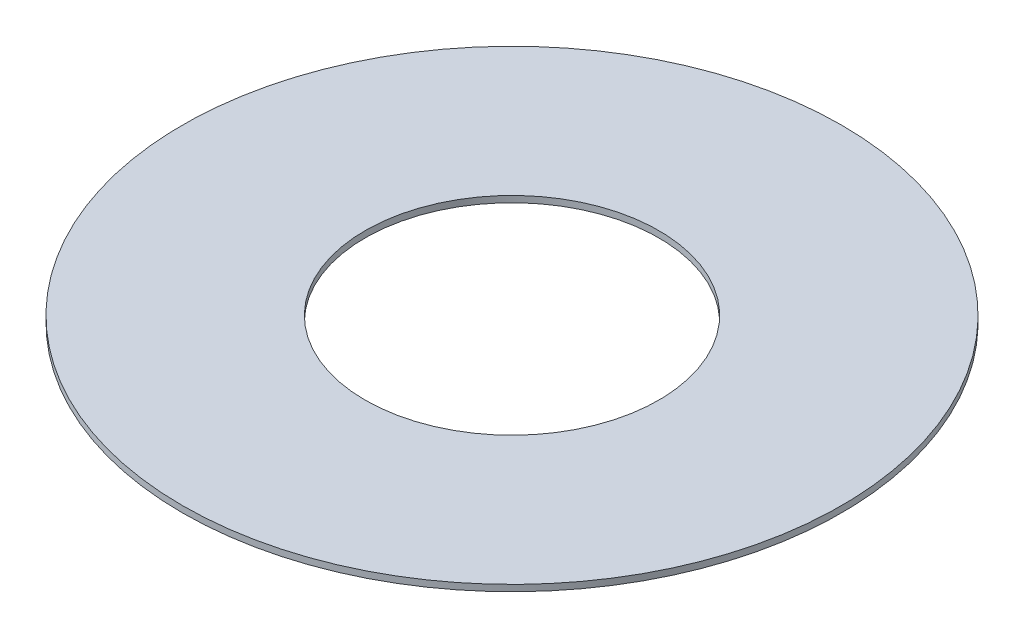
ISO-10303-21;
HEADER;
FILE_DESCRIPTION(('STEP AP214'),'2;1');
FILE_NAME('part.step','',(''),(''),'','','');
FILE_SCHEMA(('AUTOMOTIVE_DESIGN { 1 0 10303 214 1 1 1 1 }'));
ENDSEC;
DATA;
#1=APPLICATION_CONTEXT('core data for automotive mechanical design processes');
#2=APPLICATION_PROTOCOL_DEFINITION('international standard','automotive_design',2000,#1);
#3=PRODUCT_CONTEXT('',#1,'mechanical');
#4=PRODUCT('Part','Part','',(#3));
#5=PRODUCT_RELATED_PRODUCT_CATEGORY('part','',(#4));
#6=PRODUCT_DEFINITION_FORMATION('','',#4);
#7=PRODUCT_DEFINITION_CONTEXT('part definition',#1,'design');
#8=PRODUCT_DEFINITION('design','',#6,#7);
#9=PRODUCT_DEFINITION_SHAPE('','',#8);
#10=(LENGTH_UNIT() NAMED_UNIT(*) SI_UNIT(.MILLI.,.METRE.));
#11=(NAMED_UNIT(*) PLANE_ANGLE_UNIT() SI_UNIT($,.RADIAN.));
#12=(NAMED_UNIT(*) SI_UNIT($,.STERADIAN.) SOLID_ANGLE_UNIT());
#13=UNCERTAINTY_MEASURE_WITH_UNIT(LENGTH_MEASURE(1.E-05),#10,'distance_accuracy_value','');
#14=(GEOMETRIC_REPRESENTATION_CONTEXT(3) GLOBAL_UNCERTAINTY_ASSIGNED_CONTEXT((#13)) GLOBAL_UNIT_ASSIGNED_CONTEXT((#10,
#11,#12)) REPRESENTATION_CONTEXT('',''));
#15=CARTESIAN_POINT('',(0.,0.,0.));
#16=DIRECTION('',(0.,0.,1.));
#17=DIRECTION('',(1.,0.,0.));
#18=AXIS2_PLACEMENT_3D('',#15,#16,#17);
#19=CARTESIAN_POINT('',(0.,1.,0.));
#20=DIRECTION('',(0.,1.,0.));
#21=DIRECTION('',(0.,0.,1.));
#22=AXIS2_PLACEMENT_3D('',#19,#20,#21);
#23=PLANE('',#22);
#24=CARTESIAN_POINT('',(0.,1.,0.));
#25=DIRECTION('',(0.,1.,0.));
#26=DIRECTION('',(0.,0.,1.));
#27=AXIS2_PLACEMENT_3D('',#24,#25,#26);
#28=CIRCLE('',#27,51.8379999999989);
#29=CARTESIAN_POINT('',(0.,1.,51.8379999999989));
#30=VERTEX_POINT('',#29);
#31=EDGE_CURVE('E10',#30,#30,#28,.T.);
#32=ORIENTED_EDGE('',*,*,#31,.T.);
#33=EDGE_LOOP('',(#32));
#34=FACE_BOUND('',#33,.T.);
#35=CARTESIAN_POINT('',(0.,1.,0.));
#36=DIRECTION('',(0.,1.,0.));
#37=DIRECTION('',(0.,0.,1.));
#38=AXIS2_PLACEMENT_3D('',#35,#36,#37);
#39=CIRCLE('',#38,23.1);
#40=CARTESIAN_POINT('',(0.,1.,23.1));
#41=VERTEX_POINT('',#40);
#42=EDGE_CURVE('E41',#41,#41,#39,.T.);
#43=ORIENTED_EDGE('',*,*,#42,.F.);
#44=EDGE_LOOP('',(#43));
#45=FACE_BOUND('',#44,.T.);
#46=ADVANCED_FACE('F30',(#34,#45),#23,.T.);
#47=CARTESIAN_POINT('',(0.,0.,0.));
#48=DIRECTION('',(0.,1.,0.));
#49=DIRECTION('',(0.,0.,1.));
#50=AXIS2_PLACEMENT_3D('',#47,#48,#49);
#51=PLANE('',#50);
#52=CARTESIAN_POINT('',(0.,0.,0.));
#53=DIRECTION('',(0.,1.,0.));
#54=DIRECTION('',(0.,0.,1.));
#55=AXIS2_PLACEMENT_3D('',#52,#53,#54);
#56=CIRCLE('',#55,51.8379999999989);
#57=CARTESIAN_POINT('',(0.,0.,51.8379999999989));
#58=VERTEX_POINT('',#57);
#59=EDGE_CURVE('E34',#58,#58,#56,.T.);
#60=ORIENTED_EDGE('',*,*,#59,.F.);
#61=EDGE_LOOP('',(#60));
#62=FACE_BOUND('',#61,.T.);
#63=CARTESIAN_POINT('',(0.,0.,0.));
#64=DIRECTION('',(0.,1.,0.));
#65=DIRECTION('',(0.,0.,1.));
#66=AXIS2_PLACEMENT_3D('',#63,#64,#65);
#67=CIRCLE('',#66,23.1);
#68=CARTESIAN_POINT('',(0.,0.,23.1));
#69=VERTEX_POINT('',#68);
#70=EDGE_CURVE('E43',#69,#69,#67,.T.);
#71=ORIENTED_EDGE('',*,*,#70,.T.);
#72=EDGE_LOOP('',(#71));
#73=FACE_BOUND('',#72,.T.);
#74=ADVANCED_FACE('F53',(#62,#73),#51,.F.);
#75=CARTESIAN_POINT('',(0.,1.,0.));
#76=DIRECTION('',(0.,-1.,0.));
#77=DIRECTION('',(0.,0.,-1.));
#78=AXIS2_PLACEMENT_3D('',#75,#76,#77);
#79=CYLINDRICAL_SURFACE('',#78,51.8379999999989);
#80=ORIENTED_EDGE('',*,*,#31,.F.);
#81=EDGE_LOOP('',(#80));
#82=FACE_BOUND('',#81,.T.);
#83=ORIENTED_EDGE('',*,*,#59,.T.);
#84=EDGE_LOOP('',(#83));
#85=FACE_BOUND('',#84,.T.);
#86=ADVANCED_FACE('F32',(#82,#85),#79,.T.);
#87=CARTESIAN_POINT('',(0.,1.,0.));
#88=DIRECTION('',(0.,-1.,0.));
#89=DIRECTION('',(0.,0.,-1.));
#90=AXIS2_PLACEMENT_3D('',#87,#88,#89);
#91=CYLINDRICAL_SURFACE('',#90,23.1);
#92=ORIENTED_EDGE('',*,*,#42,.T.);
#93=EDGE_LOOP('',(#92));
#94=FACE_BOUND('',#93,.T.);
#95=ORIENTED_EDGE('',*,*,#70,.F.);
#96=EDGE_LOOP('',(#95));
#97=FACE_BOUND('',#96,.T.);
#98=ADVANCED_FACE('F49',(#94,#97),#91,.F.);
#99=CLOSED_SHELL('',(#46,#74,#86,#98));
#100=MANIFOLD_SOLID_BREP('B2',#99);
#101=ADVANCED_BREP_SHAPE_REPRESENTATION('',(#18,#100),#14);
#102=SHAPE_DEFINITION_REPRESENTATION(#9,#101);
ENDSEC;
END-ISO-10303-21;
